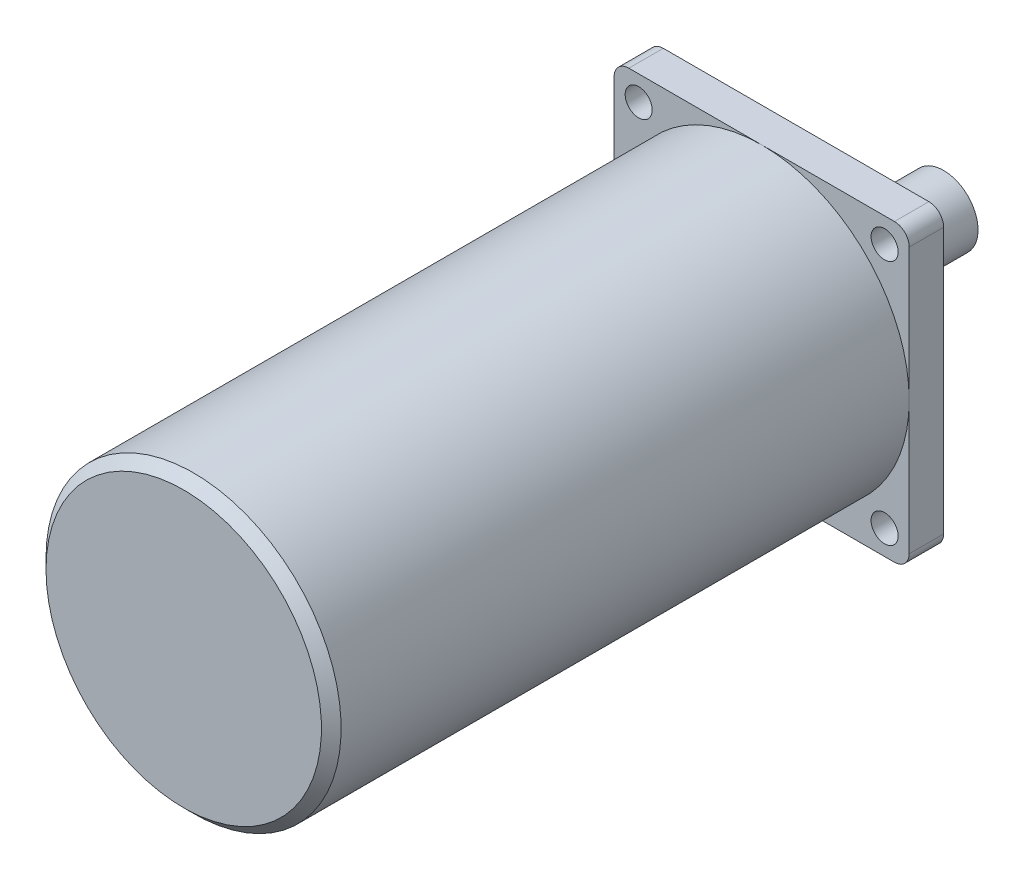
ISO-10303-21;
HEADER;
FILE_DESCRIPTION(('STEP AP214'),'2;1');
FILE_NAME('part.step','',(''),(''),'','','');
FILE_SCHEMA(('AUTOMOTIVE_DESIGN { 1 0 10303 214 1 1 1 1 }'));
ENDSEC;
DATA;
#1=APPLICATION_CONTEXT('core data for automotive mechanical design processes');
#2=APPLICATION_PROTOCOL_DEFINITION('international standard','automotive_design',2000,#1);
#3=PRODUCT_CONTEXT('',#1,'mechanical');
#4=PRODUCT('Part','Part','',(#3));
#5=PRODUCT_RELATED_PRODUCT_CATEGORY('part','',(#4));
#6=PRODUCT_DEFINITION_FORMATION('','',#4);
#7=PRODUCT_DEFINITION_CONTEXT('part definition',#1,'design');
#8=PRODUCT_DEFINITION('design','',#6,#7);
#9=PRODUCT_DEFINITION_SHAPE('','',#8);
#10=(LENGTH_UNIT() NAMED_UNIT(*) SI_UNIT(.MILLI.,.METRE.));
#11=(NAMED_UNIT(*) PLANE_ANGLE_UNIT() SI_UNIT($,.RADIAN.));
#12=(NAMED_UNIT(*) SI_UNIT($,.STERADIAN.) SOLID_ANGLE_UNIT());
#13=UNCERTAINTY_MEASURE_WITH_UNIT(LENGTH_MEASURE(1.E-05),#10,'distance_accuracy_value','');
#14=(GEOMETRIC_REPRESENTATION_CONTEXT(3) GLOBAL_UNCERTAINTY_ASSIGNED_CONTEXT((#13)) GLOBAL_UNIT_ASSIGNED_CONTEXT((#10,
#11,#12)) REPRESENTATION_CONTEXT('',''));
#15=CARTESIAN_POINT('',(0.,0.,0.));
#16=DIRECTION('',(0.,0.,1.));
#17=DIRECTION('',(1.,0.,0.));
#18=AXIS2_PLACEMENT_3D('',#15,#16,#17);
#19=CARTESIAN_POINT('',(30.,30.,-3.));
#20=DIRECTION('',(0.,0.,-1.));
#21=DIRECTION('',(-1.,0.,0.));
#22=AXIS2_PLACEMENT_3D('',#19,#20,#21);
#23=PLANE('',#22);
#24=CARTESIAN_POINT('',(30.,30.,-3.));
#25=DIRECTION('',(0.,0.,-1.));
#26=DIRECTION('',(-1.,0.,0.));
#27=AXIS2_PLACEMENT_3D('',#24,#25,#26);
#28=CIRCLE('',#27,25.);
#29=CARTESIAN_POINT('',(5.,30.,-3.));
#30=VERTEX_POINT('',#29);
#31=EDGE_CURVE('E211',#30,#30,#28,.T.);
#32=ORIENTED_EDGE('',*,*,#31,.T.);
#33=EDGE_LOOP('',(#32));
#34=FACE_BOUND('',#33,.T.);
#35=CARTESIAN_POINT('',(30.,30.,-3.));
#36=DIRECTION('',(0.,0.,-1.));
#37=DIRECTION('',(-1.,0.,0.));
#38=AXIS2_PLACEMENT_3D('',#35,#36,#37);
#39=CIRCLE('',#38,7.);
#40=CARTESIAN_POINT('',(23.,30.,-3.));
#41=VERTEX_POINT('',#40);
#42=EDGE_CURVE('E202',#41,#41,#39,.T.);
#43=ORIENTED_EDGE('',*,*,#42,.F.);
#44=EDGE_LOOP('',(#43));
#45=FACE_BOUND('',#44,.T.);
#46=ADVANCED_FACE('F32',(#34,#45),#23,.T.);
#47=CARTESIAN_POINT('',(0.,60.,0.));
#48=DIRECTION('',(0.,0.,-1.));
#49=DIRECTION('',(-1.,0.,0.));
#50=AXIS2_PLACEMENT_3D('',#47,#48,#49);
#51=PLANE('',#50);
#52=CARTESIAN_POINT('',(55.,55.,0.));
#53=DIRECTION('',(0.,0.,-1.));
#54=DIRECTION('',(-1.,0.,0.));
#55=AXIS2_PLACEMENT_3D('',#52,#53,#54);
#56=CIRCLE('',#55,2.75);
#57=CARTESIAN_POINT('',(52.25,55.,0.));
#58=VERTEX_POINT('',#57);
#59=EDGE_CURVE('E172',#58,#58,#56,.T.);
#60=ORIENTED_EDGE('',*,*,#59,.F.);
#61=EDGE_LOOP('',(#60));
#62=FACE_BOUND('',#61,.T.);
#63=CARTESIAN_POINT('',(4.99999999999997,55.,0.));
#64=DIRECTION('',(0.,0.,-1.));
#65=DIRECTION('',(1.,0.,0.));
#66=AXIS2_PLACEMENT_3D('',#63,#64,#65);
#67=CIRCLE('',#66,2.75);
#68=CARTESIAN_POINT('',(7.74999999999997,55.,0.));
#69=VERTEX_POINT('',#68);
#70=EDGE_CURVE('E162',#69,#69,#67,.T.);
#71=ORIENTED_EDGE('',*,*,#70,.F.);
#72=EDGE_LOOP('',(#71));
#73=FACE_BOUND('',#72,.T.);
#74=CARTESIAN_POINT('',(55.,4.99999999999999,0.));
#75=DIRECTION('',(0.,0.,-1.));
#76=DIRECTION('',(1.,0.,0.));
#77=AXIS2_PLACEMENT_3D('',#74,#75,#76);
#78=CIRCLE('',#77,2.75);
#79=CARTESIAN_POINT('',(57.75,4.99999999999999,0.));
#80=VERTEX_POINT('',#79);
#81=EDGE_CURVE('E159',#80,#80,#78,.T.);
#82=ORIENTED_EDGE('',*,*,#81,.F.);
#83=EDGE_LOOP('',(#82));
#84=FACE_BOUND('',#83,.T.);
#85=CARTESIAN_POINT('',(4.99999999999997,5.,0.));
#86=DIRECTION('',(0.,0.,-1.));
#87=DIRECTION('',(-1.,0.,0.));
#88=AXIS2_PLACEMENT_3D('',#85,#86,#87);
#89=CIRCLE('',#88,2.75);
#90=CARTESIAN_POINT('',(2.24999999999997,5.,0.));
#91=VERTEX_POINT('',#90);
#92=EDGE_CURVE('E156',#91,#91,#89,.T.);
#93=ORIENTED_EDGE('',*,*,#92,.F.);
#94=EDGE_LOOP('',(#93));
#95=FACE_BOUND('',#94,.T.);
#96=DIRECTION('',(0.,1.,0.));
#97=VECTOR('',#96,1.);
#98=CARTESIAN_POINT('',(60.,0.,0.));
#99=LINE('',#98,#97);
#100=CARTESIAN_POINT('',(60.,3.,0.));
#101=VERTEX_POINT('',#100);
#102=CARTESIAN_POINT('',(60.,57.,0.));
#103=VERTEX_POINT('',#102);
#104=EDGE_CURVE('E221',#101,#103,#99,.T.);
#105=ORIENTED_EDGE('',*,*,#104,.F.);
#106=CARTESIAN_POINT('',(57.,3.,0.));
#107=DIRECTION('',(0.,0.,-1.));
#108=DIRECTION('',(-1.,0.,0.));
#109=AXIS2_PLACEMENT_3D('',#106,#107,#108);
#110=CIRCLE('',#109,3.);
#111=CARTESIAN_POINT('',(57.,0.,0.));
#112=VERTEX_POINT('',#111);
#113=EDGE_CURVE('E57',#101,#112,#110,.T.);
#114=ORIENTED_EDGE('',*,*,#113,.T.);
#115=DIRECTION('',(1.,0.,0.));
#116=VECTOR('',#115,1.);
#117=CARTESIAN_POINT('',(0.,0.,0.));
#118=LINE('',#117,#116);
#119=CARTESIAN_POINT('',(3.,0.,0.));
#120=VERTEX_POINT('',#119);
#121=EDGE_CURVE('E219',#120,#112,#118,.T.);
#122=ORIENTED_EDGE('',*,*,#121,.F.);
#123=CARTESIAN_POINT('',(3.,3.,0.));
#124=DIRECTION('',(0.,0.,-1.));
#125=DIRECTION('',(-1.,0.,0.));
#126=AXIS2_PLACEMENT_3D('',#123,#124,#125);
#127=CIRCLE('',#126,3.);
#128=CARTESIAN_POINT('',(0.,3.,0.));
#129=VERTEX_POINT('',#128);
#130=EDGE_CURVE('E135',#120,#129,#127,.T.);
#131=ORIENTED_EDGE('',*,*,#130,.T.);
#132=DIRECTION('',(0.,-1.,0.));
#133=VECTOR('',#132,1.);
#134=CARTESIAN_POINT('',(0.,0.,0.));
#135=LINE('',#134,#133);
#136=CARTESIAN_POINT('',(0.,57.,0.));
#137=VERTEX_POINT('',#136);
#138=EDGE_CURVE('E214',#137,#129,#135,.T.);
#139=ORIENTED_EDGE('',*,*,#138,.F.);
#140=CARTESIAN_POINT('',(3.,57.,0.));
#141=DIRECTION('',(0.,0.,-1.));
#142=DIRECTION('',(-1.,0.,0.));
#143=AXIS2_PLACEMENT_3D('',#140,#141,#142);
#144=CIRCLE('',#143,3.);
#145=CARTESIAN_POINT('',(3.,60.,0.));
#146=VERTEX_POINT('',#145);
#147=EDGE_CURVE('E232',#137,#146,#144,.T.);
#148=ORIENTED_EDGE('',*,*,#147,.T.);
#149=DIRECTION('',(-1.,0.,0.));
#150=VECTOR('',#149,1.);
#151=CARTESIAN_POINT('',(0.,60.,0.));
#152=LINE('',#151,#150);
#153=CARTESIAN_POINT('',(57.,60.,0.));
#154=VERTEX_POINT('',#153);
#155=EDGE_CURVE('E224',#154,#146,#152,.T.);
#156=ORIENTED_EDGE('',*,*,#155,.F.);
#157=CARTESIAN_POINT('',(57.,57.,0.));
#158=DIRECTION('',(0.,0.,-1.));
#159=DIRECTION('',(-1.,0.,0.));
#160=AXIS2_PLACEMENT_3D('',#157,#158,#159);
#161=CIRCLE('',#160,3.);
#162=EDGE_CURVE('E140',#154,#103,#161,.T.);
#163=ORIENTED_EDGE('',*,*,#162,.T.);
#164=EDGE_LOOP('',(#105,#114,#122,#131,#139,#148,#156,#163));
#165=FACE_BOUND('',#164,.T.);
#166=CARTESIAN_POINT('',(30.,30.,0.));
#167=DIRECTION('',(0.,0.,-1.));
#168=DIRECTION('',(-1.,0.,0.));
#169=AXIS2_PLACEMENT_3D('',#166,#167,#168);
#170=CIRCLE('',#169,25.);
#171=CARTESIAN_POINT('',(5.,30.,0.));
#172=VERTEX_POINT('',#171);
#173=EDGE_CURVE('E208',#172,#172,#170,.T.);
#174=ORIENTED_EDGE('',*,*,#173,.F.);
#175=EDGE_LOOP('',(#174));
#176=FACE_BOUND('',#175,.T.);
#177=ADVANCED_FACE('F236',(#62,#73,#84,#95,#165,#176),#51,.T.);
#178=CARTESIAN_POINT('',(0.,0.,124.5));
#179=DIRECTION('',(1.,0.,0.));
#180=DIRECTION('',(0.,0.,-1.));
#181=AXIS2_PLACEMENT_3D('',#178,#179,#180);
#182=PLANE('',#181);
#183=DIRECTION('',(0.,0.,-1.));
#184=VECTOR('',#183,1.);
#185=CARTESIAN_POINT('',(0.,3.,124.5));
#186=LINE('',#185,#184);
#187=CARTESIAN_POINT('',(2.67446194314111E-13,2.99999999999968,7.));
#188=VERTEX_POINT('',#187);
#189=EDGE_CURVE('E150',#129,#188,#186,.F.);
#190=ORIENTED_EDGE('',*,*,#189,.T.);
#191=DIRECTION('',(0.,-1.,0.));
#192=VECTOR('',#191,1.);
#193=CARTESIAN_POINT('',(0.,29.9999999999997,7.));
#194=LINE('',#193,#192);
#195=CARTESIAN_POINT('',(0.,30.,7.));
#196=VERTEX_POINT('',#195);
#197=EDGE_CURVE('E119',#196,#188,#194,.T.);
#198=ORIENTED_EDGE('',*,*,#197,.F.);
#199=DIRECTION('',(0.,-1.,0.));
#200=VECTOR('',#199,1.);
#201=CARTESIAN_POINT('',(-2.0122792321331E-13,56.9999999999998,7.));
#202=LINE('',#201,#200);
#203=CARTESIAN_POINT('',(-2.0122792321331E-13,56.9999999999998,7.));
#204=VERTEX_POINT('',#203);
#205=EDGE_CURVE('E124',#204,#196,#202,.T.);
#206=ORIENTED_EDGE('',*,*,#205,.F.);
#207=DIRECTION('',(0.,0.,-1.));
#208=VECTOR('',#207,1.);
#209=CARTESIAN_POINT('',(0.,57.,124.5));
#210=LINE('',#209,#208);
#211=EDGE_CURVE('E148',#204,#137,#210,.T.);
#212=ORIENTED_EDGE('',*,*,#211,.T.);
#213=ORIENTED_EDGE('',*,*,#138,.T.);
#214=EDGE_LOOP('',(#190,#198,#206,#212,#213));
#215=FACE_BOUND('',#214,.T.);
#216=ADVANCED_FACE('F267',(#215),#182,.F.);
#217=CARTESIAN_POINT('',(0.,0.,124.5));
#218=DIRECTION('',(0.,1.,0.));
#219=DIRECTION('',(0.,0.,1.));
#220=AXIS2_PLACEMENT_3D('',#217,#218,#219);
#221=PLANE('',#220);
#222=DIRECTION('',(1.,0.,0.));
#223=VECTOR('',#222,1.);
#224=CARTESIAN_POINT('',(30.,0.,7.));
#225=LINE('',#224,#223);
#226=CARTESIAN_POINT('',(30.0000000000003,0.,7.));
#227=VERTEX_POINT('',#226);
#228=CARTESIAN_POINT('',(57.,0.,7.00000000000001));
#229=VERTEX_POINT('',#228);
#230=EDGE_CURVE('E49',#227,#229,#225,.T.);
#231=ORIENTED_EDGE('',*,*,#230,.F.);
#232=DIRECTION('',(1.,0.,0.));
#233=VECTOR('',#232,1.);
#234=CARTESIAN_POINT('',(3.0000000000003,-2.84494650060196E-13,7.));
#235=LINE('',#234,#233);
#236=CARTESIAN_POINT('',(3.0000000000003,-2.84494650060196E-13,7.));
#237=VERTEX_POINT('',#236);
#238=EDGE_CURVE('E117',#237,#227,#235,.T.);
#239=ORIENTED_EDGE('',*,*,#238,.F.);
#240=DIRECTION('',(0.,0.,-1.));
#241=VECTOR('',#240,1.);
#242=CARTESIAN_POINT('',(3.,0.,124.5));
#243=LINE('',#242,#241);
#244=EDGE_CURVE('E128',#237,#120,#243,.T.);
#245=ORIENTED_EDGE('',*,*,#244,.T.);
#246=ORIENTED_EDGE('',*,*,#121,.T.);
#247=DIRECTION('',(0.,0.,-1.));
#248=VECTOR('',#247,1.);
#249=CARTESIAN_POINT('',(57.,0.,124.5));
#250=LINE('',#249,#248);
#251=EDGE_CURVE('E136',#112,#229,#250,.F.);
#252=ORIENTED_EDGE('',*,*,#251,.T.);
#253=EDGE_LOOP('',(#231,#239,#245,#246,#252));
#254=FACE_BOUND('',#253,.T.);
#255=ADVANCED_FACE('F127',(#254),#221,.F.);
#256=CARTESIAN_POINT('',(60.,0.,124.5));
#257=DIRECTION('',(-1.,0.,0.));
#258=DIRECTION('',(0.,0.,1.));
#259=AXIS2_PLACEMENT_3D('',#256,#257,#258);
#260=PLANE('',#259);
#261=DIRECTION('',(0.,0.,-1.));
#262=VECTOR('',#261,1.);
#263=CARTESIAN_POINT('',(60.,57.,124.5));
#264=LINE('',#263,#262);
#265=CARTESIAN_POINT('',(59.9999999999999,57.0000000000001,7.));
#266=VERTEX_POINT('',#265);
#267=EDGE_CURVE('E227',#103,#266,#264,.F.);
#268=ORIENTED_EDGE('',*,*,#267,.T.);
#269=DIRECTION('',(0.,1.,0.));
#270=VECTOR('',#269,1.);
#271=CARTESIAN_POINT('',(60.,30.0000000000001,7.));
#272=LINE('',#271,#270);
#273=CARTESIAN_POINT('',(60.,30.0000000000001,7.));
#274=VERTEX_POINT('',#273);
#275=EDGE_CURVE('E194',#274,#266,#272,.T.);
#276=ORIENTED_EDGE('',*,*,#275,.F.);
#277=DIRECTION('',(0.,1.,0.));
#278=VECTOR('',#277,1.);
#279=CARTESIAN_POINT('',(60.,3.,7.));
#280=LINE('',#279,#278);
#281=CARTESIAN_POINT('',(60.,3.,7.));
#282=VERTEX_POINT('',#281);
#283=EDGE_CURVE('E193',#282,#274,#280,.T.);
#284=ORIENTED_EDGE('',*,*,#283,.F.);
#285=DIRECTION('',(0.,0.,-1.));
#286=VECTOR('',#285,1.);
#287=CARTESIAN_POINT('',(60.,3.,124.5));
#288=LINE('',#287,#286);
#289=EDGE_CURVE('E230',#282,#101,#288,.T.);
#290=ORIENTED_EDGE('',*,*,#289,.T.);
#291=ORIENTED_EDGE('',*,*,#104,.T.);
#292=EDGE_LOOP('',(#268,#276,#284,#290,#291));
#293=FACE_BOUND('',#292,.T.);
#294=ADVANCED_FACE('F242',(#293),#260,.F.);
#295=CARTESIAN_POINT('',(0.,60.,124.5));
#296=DIRECTION('',(0.,-1.,0.));
#297=DIRECTION('',(0.,0.,-1.));
#298=AXIS2_PLACEMENT_3D('',#295,#296,#297);
#299=PLANE('',#298);
#300=DIRECTION('',(0.,0.,-1.));
#301=VECTOR('',#300,1.);
#302=CARTESIAN_POINT('',(3.,60.,124.5));
#303=LINE('',#302,#301);
#304=CARTESIAN_POINT('',(2.99999999999978,59.9999999999998,7.));
#305=VERTEX_POINT('',#304);
#306=EDGE_CURVE('E138',#146,#305,#303,.F.);
#307=ORIENTED_EDGE('',*,*,#306,.T.);
#308=DIRECTION('',(-1.,0.,0.));
#309=VECTOR('',#308,1.);
#310=CARTESIAN_POINT('',(29.9999999999998,60.,7.));
#311=LINE('',#310,#309);
#312=CARTESIAN_POINT('',(29.9999999999998,60.,7.));
#313=VERTEX_POINT('',#312);
#314=EDGE_CURVE('E181',#313,#305,#311,.T.);
#315=ORIENTED_EDGE('',*,*,#314,.F.);
#316=DIRECTION('',(-1.,0.,0.));
#317=VECTOR('',#316,1.);
#318=CARTESIAN_POINT('',(56.9999999999999,60.0000000000001,7.));
#319=LINE('',#318,#317);
#320=CARTESIAN_POINT('',(56.9999999999999,60.0000000000001,7.));
#321=VERTEX_POINT('',#320);
#322=EDGE_CURVE('E185',#321,#313,#319,.T.);
#323=ORIENTED_EDGE('',*,*,#322,.F.);
#324=DIRECTION('',(0.,0.,-1.));
#325=VECTOR('',#324,1.);
#326=CARTESIAN_POINT('',(57.,60.,124.5));
#327=LINE('',#326,#325);
#328=EDGE_CURVE('E146',#321,#154,#327,.T.);
#329=ORIENTED_EDGE('',*,*,#328,.T.);
#330=ORIENTED_EDGE('',*,*,#155,.T.);
#331=EDGE_LOOP('',(#307,#315,#323,#329,#330));
#332=FACE_BOUND('',#331,.T.);
#333=ADVANCED_FACE('F253',(#332),#299,.F.);
#334=CARTESIAN_POINT('',(0.,60.,124.5));
#335=DIRECTION('',(0.,0.,-1.));
#336=DIRECTION('',(-1.,0.,0.));
#337=AXIS2_PLACEMENT_3D('',#334,#335,#336);
#338=PLANE('',#337);
#339=CARTESIAN_POINT('',(30.,30.,124.5));
#340=DIRECTION('',(0.,0.,-1.));
#341=DIRECTION('',(-1.,0.,0.));
#342=AXIS2_PLACEMENT_3D('',#339,#340,#341);
#343=CIRCLE('',#342,28.);
#344=CARTESIAN_POINT('',(1.99999999999999,30.,124.5));
#345=VERTEX_POINT('',#344);
#346=EDGE_CURVE('E12',#345,#345,#343,.F.);
#347=ORIENTED_EDGE('',*,*,#346,.T.);
#348=EDGE_LOOP('',(#347));
#349=FACE_BOUND('',#348,.T.);
#350=ADVANCED_FACE('F300',(#349),#338,.F.);
#351=CARTESIAN_POINT('',(30.,30.,-3.));
#352=DIRECTION('',(0.,0.,1.));
#353=DIRECTION('',(1.,0.,0.));
#354=AXIS2_PLACEMENT_3D('',#351,#352,#353);
#355=CYLINDRICAL_SURFACE('',#354,25.);
#356=ORIENTED_EDGE('',*,*,#31,.F.);
#357=EDGE_LOOP('',(#356));
#358=FACE_BOUND('',#357,.T.);
#359=ORIENTED_EDGE('',*,*,#173,.T.);
#360=EDGE_LOOP('',(#359));
#361=FACE_BOUND('',#360,.T.);
#362=ADVANCED_FACE('F297',(#358,#361),#355,.T.);
#363=CARTESIAN_POINT('',(30.,30.,-30.));
#364=DIRECTION('',(0.,0.,1.));
#365=DIRECTION('',(1.,0.,0.));
#366=AXIS2_PLACEMENT_3D('',#363,#364,#365);
#367=CYLINDRICAL_SURFACE('',#366,7.);
#368=CARTESIAN_POINT('',(30.,30.,-30.));
#369=DIRECTION('',(0.,0.,-1.));
#370=DIRECTION('',(-1.,0.,0.));
#371=AXIS2_PLACEMENT_3D('',#368,#369,#370);
#372=CIRCLE('',#371,7.);
#373=CARTESIAN_POINT('',(23.,30.,-30.));
#374=VERTEX_POINT('',#373);
#375=EDGE_CURVE('E205',#374,#374,#372,.T.);
#376=ORIENTED_EDGE('',*,*,#375,.F.);
#377=EDGE_LOOP('',(#376));
#378=FACE_BOUND('',#377,.T.);
#379=ORIENTED_EDGE('',*,*,#42,.T.);
#380=EDGE_LOOP('',(#379));
#381=FACE_BOUND('',#380,.T.);
#382=ADVANCED_FACE('F295',(#378,#381),#367,.T.);
#383=CARTESIAN_POINT('',(30.,30.,-30.));
#384=DIRECTION('',(0.,0.,-1.));
#385=DIRECTION('',(-1.,0.,0.));
#386=AXIS2_PLACEMENT_3D('',#383,#384,#385);
#387=PLANE('',#386);
#388=ORIENTED_EDGE('',*,*,#375,.T.);
#389=EDGE_LOOP('',(#388));
#390=FACE_BOUND('',#389,.T.);
#391=ADVANCED_FACE('F315',(#390),#387,.T.);
#392=CARTESIAN_POINT('',(57.,3.,124.5));
#393=DIRECTION('',(0.,0.,-1.));
#394=DIRECTION('',(-1.,0.,0.));
#395=AXIS2_PLACEMENT_3D('',#392,#393,#394);
#396=CYLINDRICAL_SURFACE('',#395,3.);
#397=CARTESIAN_POINT('',(57.,3.,7.));
#398=DIRECTION('',(0.,0.,-1.));
#399=DIRECTION('',(-1.,0.,0.));
#400=AXIS2_PLACEMENT_3D('',#397,#398,#399);
#401=CIRCLE('',#400,3.);
#402=EDGE_CURVE('E200',#229,#282,#401,.F.);
#403=ORIENTED_EDGE('',*,*,#402,.F.);
#404=ORIENTED_EDGE('',*,*,#251,.F.);
#405=ORIENTED_EDGE('',*,*,#113,.F.);
#406=ORIENTED_EDGE('',*,*,#289,.F.);
#407=EDGE_LOOP('',(#403,#404,#405,#406));
#408=FACE_BOUND('',#407,.T.);
#409=ADVANCED_FACE('F263',(#408),#396,.T.);
#410=CARTESIAN_POINT('',(57.,57.,124.5));
#411=DIRECTION('',(0.,0.,-1.));
#412=DIRECTION('',(-1.,0.,0.));
#413=AXIS2_PLACEMENT_3D('',#410,#411,#412);
#414=CYLINDRICAL_SURFACE('',#413,3.);
#415=CARTESIAN_POINT('',(56.9999999999999,57.0000000000001,7.));
#416=DIRECTION('',(0.,0.,-1.));
#417=DIRECTION('',(-1.,0.,0.));
#418=AXIS2_PLACEMENT_3D('',#415,#416,#417);
#419=CIRCLE('',#418,3.);
#420=EDGE_CURVE('E191',#266,#321,#419,.F.);
#421=ORIENTED_EDGE('',*,*,#420,.F.);
#422=ORIENTED_EDGE('',*,*,#267,.F.);
#423=ORIENTED_EDGE('',*,*,#162,.F.);
#424=ORIENTED_EDGE('',*,*,#328,.F.);
#425=EDGE_LOOP('',(#421,#422,#423,#424));
#426=FACE_BOUND('',#425,.T.);
#427=ADVANCED_FACE('F247',(#426),#414,.T.);
#428=CARTESIAN_POINT('',(3.,3.,124.5));
#429=DIRECTION('',(0.,0.,-1.));
#430=DIRECTION('',(-1.,0.,0.));
#431=AXIS2_PLACEMENT_3D('',#428,#429,#430);
#432=CYLINDRICAL_SURFACE('',#431,3.);
#433=CARTESIAN_POINT('',(3.00000000000027,2.99999999999972,7.));
#434=DIRECTION('',(0.,0.,-1.));
#435=DIRECTION('',(-1.,0.,0.));
#436=AXIS2_PLACEMENT_3D('',#433,#434,#435);
#437=CIRCLE('',#436,3.);
#438=EDGE_CURVE('E114',#188,#237,#437,.F.);
#439=ORIENTED_EDGE('',*,*,#438,.F.);
#440=ORIENTED_EDGE('',*,*,#189,.F.);
#441=ORIENTED_EDGE('',*,*,#130,.F.);
#442=ORIENTED_EDGE('',*,*,#244,.F.);
#443=EDGE_LOOP('',(#439,#440,#441,#442));
#444=FACE_BOUND('',#443,.T.);
#445=ADVANCED_FACE('F134',(#444),#432,.T.);
#446=CARTESIAN_POINT('',(3.,57.,124.5));
#447=DIRECTION('',(0.,0.,-1.));
#448=DIRECTION('',(-1.,0.,0.));
#449=AXIS2_PLACEMENT_3D('',#446,#447,#448);
#450=CYLINDRICAL_SURFACE('',#449,3.);
#451=CARTESIAN_POINT('',(2.9999999999998,56.9999999999998,7.));
#452=DIRECTION('',(0.,0.,-1.));
#453=DIRECTION('',(-1.,0.,0.));
#454=AXIS2_PLACEMENT_3D('',#451,#452,#453);
#455=CIRCLE('',#454,3.);
#456=EDGE_CURVE('E183',#305,#204,#455,.F.);
#457=ORIENTED_EDGE('',*,*,#456,.F.);
#458=ORIENTED_EDGE('',*,*,#306,.F.);
#459=ORIENTED_EDGE('',*,*,#147,.F.);
#460=ORIENTED_EDGE('',*,*,#211,.F.);
#461=EDGE_LOOP('',(#457,#458,#459,#460));
#462=FACE_BOUND('',#461,.T.);
#463=ADVANCED_FACE('F272',(#462),#450,.T.);
#464=CARTESIAN_POINT('',(0.,60.,7.));
#465=DIRECTION('',(0.,0.,-1.));
#466=DIRECTION('',(-1.,0.,0.));
#467=AXIS2_PLACEMENT_3D('',#464,#465,#466);
#468=PLANE('',#467);
#469=CARTESIAN_POINT('',(55.,4.99999999999999,7.00000000000001));
#470=DIRECTION('',(0.,0.,-1.));
#471=DIRECTION('',(-1.,0.,0.));
#472=AXIS2_PLACEMENT_3D('',#469,#470,#471);
#473=CIRCLE('',#472,2.75);
#474=CARTESIAN_POINT('',(52.25,4.99999999999999,7.00000000000001));
#475=VERTEX_POINT('',#474);
#476=EDGE_CURVE('E157',#475,#475,#473,.T.);
#477=ORIENTED_EDGE('',*,*,#476,.T.);
#478=EDGE_LOOP('',(#477));
#479=FACE_BOUND('',#478,.T.);
#480=ORIENTED_EDGE('',*,*,#402,.T.);
#481=ORIENTED_EDGE('',*,*,#283,.T.);
#482=CARTESIAN_POINT('',(30.,30.,7.));
#483=DIRECTION('',(0.,0.,-1.));
#484=DIRECTION('',(-1.,0.,0.));
#485=AXIS2_PLACEMENT_3D('',#482,#483,#484);
#486=CIRCLE('',#485,30.);
#487=EDGE_CURVE('E199',#274,#227,#486,.T.);
#488=ORIENTED_EDGE('',*,*,#487,.T.);
#489=ORIENTED_EDGE('',*,*,#230,.T.);
#490=EDGE_LOOP('',(#480,#481,#488,#489));
#491=FACE_BOUND('',#490,.T.);
#492=ADVANCED_FACE('F320',(#479,#491),#468,.F.);
#493=CARTESIAN_POINT('',(30.,30.,-42.4264068711929));
#494=DIRECTION('',(0.,0.,1.));
#495=DIRECTION('',(1.,0.,0.));
#496=AXIS2_PLACEMENT_3D('',#493,#494,#495);
#497=CYLINDRICAL_SURFACE('',#496,30.);
#498=CARTESIAN_POINT('',(30.,30.,122.5));
#499=DIRECTION('',(0.,0.,-1.));
#500=DIRECTION('',(-1.,0.,0.));
#501=AXIS2_PLACEMENT_3D('',#498,#499,#500);
#502=CIRCLE('',#501,30.);
#503=CARTESIAN_POINT('',(0.,30.,122.5));
#504=VERTEX_POINT('',#503);
#505=EDGE_CURVE('E41',#504,#504,#502,.T.);
#506=ORIENTED_EDGE('',*,*,#505,.T.);
#507=EDGE_LOOP('',(#506));
#508=FACE_BOUND('',#507,.T.);
#509=ORIENTED_EDGE('',*,*,#487,.F.);
#510=CARTESIAN_POINT('',(30.,30.,7.));
#511=DIRECTION('',(0.,0.,-1.));
#512=DIRECTION('',(-1.,0.,0.));
#513=AXIS2_PLACEMENT_3D('',#510,#511,#512);
#514=CIRCLE('',#513,30.);
#515=EDGE_CURVE('E190',#313,#274,#514,.T.);
#516=ORIENTED_EDGE('',*,*,#515,.F.);
#517=CARTESIAN_POINT('',(30.,30.,7.));
#518=DIRECTION('',(0.,0.,-1.));
#519=DIRECTION('',(-1.,0.,0.));
#520=AXIS2_PLACEMENT_3D('',#517,#518,#519);
#521=CIRCLE('',#520,30.);
#522=EDGE_CURVE('E179',#196,#313,#521,.T.);
#523=ORIENTED_EDGE('',*,*,#522,.F.);
#524=CARTESIAN_POINT('',(30.,30.,7.));
#525=DIRECTION('',(0.,0.,-1.));
#526=DIRECTION('',(-1.,0.,0.));
#527=AXIS2_PLACEMENT_3D('',#524,#525,#526);
#528=CIRCLE('',#527,30.);
#529=EDGE_CURVE('E131',#227,#196,#528,.T.);
#530=ORIENTED_EDGE('',*,*,#529,.F.);
#531=EDGE_LOOP('',(#509,#516,#523,#530));
#532=FACE_BOUND('',#531,.T.);
#533=ADVANCED_FACE('F261',(#508,#532),#497,.T.);
#534=CARTESIAN_POINT('',(0.,60.,7.));
#535=DIRECTION('',(0.,0.,-1.));
#536=DIRECTION('',(-1.,0.,0.));
#537=AXIS2_PLACEMENT_3D('',#534,#535,#536);
#538=PLANE('',#537);
#539=CARTESIAN_POINT('',(55.,55.,7.00000000000001));
#540=DIRECTION('',(0.,0.,-1.));
#541=DIRECTION('',(-1.,0.,0.));
#542=AXIS2_PLACEMENT_3D('',#539,#540,#541);
#543=CIRCLE('',#542,2.75);
#544=CARTESIAN_POINT('',(52.25,55.,7.00000000000001));
#545=VERTEX_POINT('',#544);
#546=EDGE_CURVE('E36',#545,#545,#543,.T.);
#547=ORIENTED_EDGE('',*,*,#546,.T.);
#548=EDGE_LOOP('',(#547));
#549=FACE_BOUND('',#548,.T.);
#550=ORIENTED_EDGE('',*,*,#420,.T.);
#551=ORIENTED_EDGE('',*,*,#322,.T.);
#552=ORIENTED_EDGE('',*,*,#515,.T.);
#553=ORIENTED_EDGE('',*,*,#275,.T.);
#554=EDGE_LOOP('',(#550,#551,#552,#553));
#555=FACE_BOUND('',#554,.T.);
#556=ADVANCED_FACE('F250',(#549,#555),#538,.F.);
#557=CARTESIAN_POINT('',(0.,60.,7.));
#558=DIRECTION('',(0.,0.,-1.));
#559=DIRECTION('',(-1.,0.,0.));
#560=AXIS2_PLACEMENT_3D('',#557,#558,#559);
#561=PLANE('',#560);
#562=CARTESIAN_POINT('',(4.99999999999997,55.,7.00000000000001));
#563=DIRECTION('',(0.,0.,-1.));
#564=DIRECTION('',(-1.,0.,0.));
#565=AXIS2_PLACEMENT_3D('',#562,#563,#564);
#566=CIRCLE('',#565,2.75);
#567=CARTESIAN_POINT('',(2.24999999999997,55.,7.00000000000001));
#568=VERTEX_POINT('',#567);
#569=EDGE_CURVE('E160',#568,#568,#566,.T.);
#570=ORIENTED_EDGE('',*,*,#569,.T.);
#571=EDGE_LOOP('',(#570));
#572=FACE_BOUND('',#571,.T.);
#573=ORIENTED_EDGE('',*,*,#456,.T.);
#574=ORIENTED_EDGE('',*,*,#205,.T.);
#575=ORIENTED_EDGE('',*,*,#522,.T.);
#576=ORIENTED_EDGE('',*,*,#314,.T.);
#577=EDGE_LOOP('',(#573,#574,#575,#576));
#578=FACE_BOUND('',#577,.T.);
#579=ADVANCED_FACE('F273',(#572,#578),#561,.F.);
#580=CARTESIAN_POINT('',(0.,60.,7.));
#581=DIRECTION('',(0.,0.,-1.));
#582=DIRECTION('',(-1.,0.,0.));
#583=AXIS2_PLACEMENT_3D('',#580,#581,#582);
#584=PLANE('',#583);
#585=CARTESIAN_POINT('',(4.99999999999997,5.,7.00000000000001));
#586=DIRECTION('',(0.,0.,-1.));
#587=DIRECTION('',(-1.,0.,0.));
#588=AXIS2_PLACEMENT_3D('',#585,#586,#587);
#589=CIRCLE('',#588,2.75);
#590=CARTESIAN_POINT('',(2.24999999999997,5.,7.00000000000001));
#591=VERTEX_POINT('',#590);
#592=EDGE_CURVE('E132',#591,#591,#589,.T.);
#593=ORIENTED_EDGE('',*,*,#592,.T.);
#594=EDGE_LOOP('',(#593));
#595=FACE_BOUND('',#594,.T.);
#596=ORIENTED_EDGE('',*,*,#438,.T.);
#597=ORIENTED_EDGE('',*,*,#238,.T.);
#598=ORIENTED_EDGE('',*,*,#529,.T.);
#599=ORIENTED_EDGE('',*,*,#197,.T.);
#600=EDGE_LOOP('',(#596,#597,#598,#599));
#601=FACE_BOUND('',#600,.T.);
#602=ADVANCED_FACE('F116',(#595,#601),#584,.F.);
#603=CARTESIAN_POINT('',(30.,30.,122.5));
#604=DIRECTION('',(0.,0.,-1.));
#605=DIRECTION('',(-1.,0.,0.));
#606=AXIS2_PLACEMENT_3D('',#603,#604,#605);
#607=CONICAL_SURFACE('',#606,30.,0.785398163397454);
#608=ORIENTED_EDGE('',*,*,#346,.F.);
#609=EDGE_LOOP('',(#608));
#610=FACE_BOUND('',#609,.T.);
#611=ORIENTED_EDGE('',*,*,#505,.F.);
#612=EDGE_LOOP('',(#611));
#613=FACE_BOUND('',#612,.T.);
#614=ADVANCED_FACE('F34',(#610,#613),#607,.T.);
#615=CARTESIAN_POINT('',(4.99999999999997,5.,124.5));
#616=DIRECTION('',(0.,0.,-1.));
#617=DIRECTION('',(-1.,0.,0.));
#618=AXIS2_PLACEMENT_3D('',#615,#616,#617);
#619=CYLINDRICAL_SURFACE('',#618,2.75);
#620=ORIENTED_EDGE('',*,*,#92,.T.);
#621=EDGE_LOOP('',(#620));
#622=FACE_BOUND('',#621,.T.);
#623=ORIENTED_EDGE('',*,*,#592,.F.);
#624=EDGE_LOOP('',(#623));
#625=FACE_BOUND('',#624,.T.);
#626=ADVANCED_FACE('F405',(#622,#625),#619,.F.);
#627=CARTESIAN_POINT('',(55.,4.99999999999999,124.5));
#628=DIRECTION('',(0.,0.,-1.));
#629=DIRECTION('',(-1.,0.,0.));
#630=AXIS2_PLACEMENT_3D('',#627,#628,#629);
#631=CYLINDRICAL_SURFACE('',#630,2.75);
#632=ORIENTED_EDGE('',*,*,#81,.T.);
#633=EDGE_LOOP('',(#632));
#634=FACE_BOUND('',#633,.T.);
#635=ORIENTED_EDGE('',*,*,#476,.F.);
#636=EDGE_LOOP('',(#635));
#637=FACE_BOUND('',#636,.T.);
#638=ADVANCED_FACE('F410',(#634,#637),#631,.F.);
#639=CARTESIAN_POINT('',(4.99999999999997,55.,124.5));
#640=DIRECTION('',(0.,0.,-1.));
#641=DIRECTION('',(-1.,0.,0.));
#642=AXIS2_PLACEMENT_3D('',#639,#640,#641);
#643=CYLINDRICAL_SURFACE('',#642,2.75);
#644=ORIENTED_EDGE('',*,*,#70,.T.);
#645=EDGE_LOOP('',(#644));
#646=FACE_BOUND('',#645,.T.);
#647=ORIENTED_EDGE('',*,*,#569,.F.);
#648=EDGE_LOOP('',(#647));
#649=FACE_BOUND('',#648,.T.);
#650=ADVANCED_FACE('F420',(#646,#649),#643,.F.);
#651=CARTESIAN_POINT('',(55.,55.,124.5));
#652=DIRECTION('',(0.,0.,-1.));
#653=DIRECTION('',(-1.,0.,0.));
#654=AXIS2_PLACEMENT_3D('',#651,#652,#653);
#655=CYLINDRICAL_SURFACE('',#654,2.75);
#656=ORIENTED_EDGE('',*,*,#59,.T.);
#657=EDGE_LOOP('',(#656));
#658=FACE_BOUND('',#657,.T.);
#659=ORIENTED_EDGE('',*,*,#546,.F.);
#660=EDGE_LOOP('',(#659));
#661=FACE_BOUND('',#660,.T.);
#662=ADVANCED_FACE('F430',(#658,#661),#655,.F.);
#663=CLOSED_SHELL('',(#46,#177,#216,#255,#294,#333,#350,#362,#382,#391,#409,#427,#445,#463,#492,
#533,#556,#579,#602,#614,#626,#638,#650,#662));
#664=MANIFOLD_SOLID_BREP('B2',#663);
#665=ADVANCED_BREP_SHAPE_REPRESENTATION('',(#18,#664),#14);
#666=SHAPE_DEFINITION_REPRESENTATION(#9,#665);
ENDSEC;
END-ISO-10303-21;
